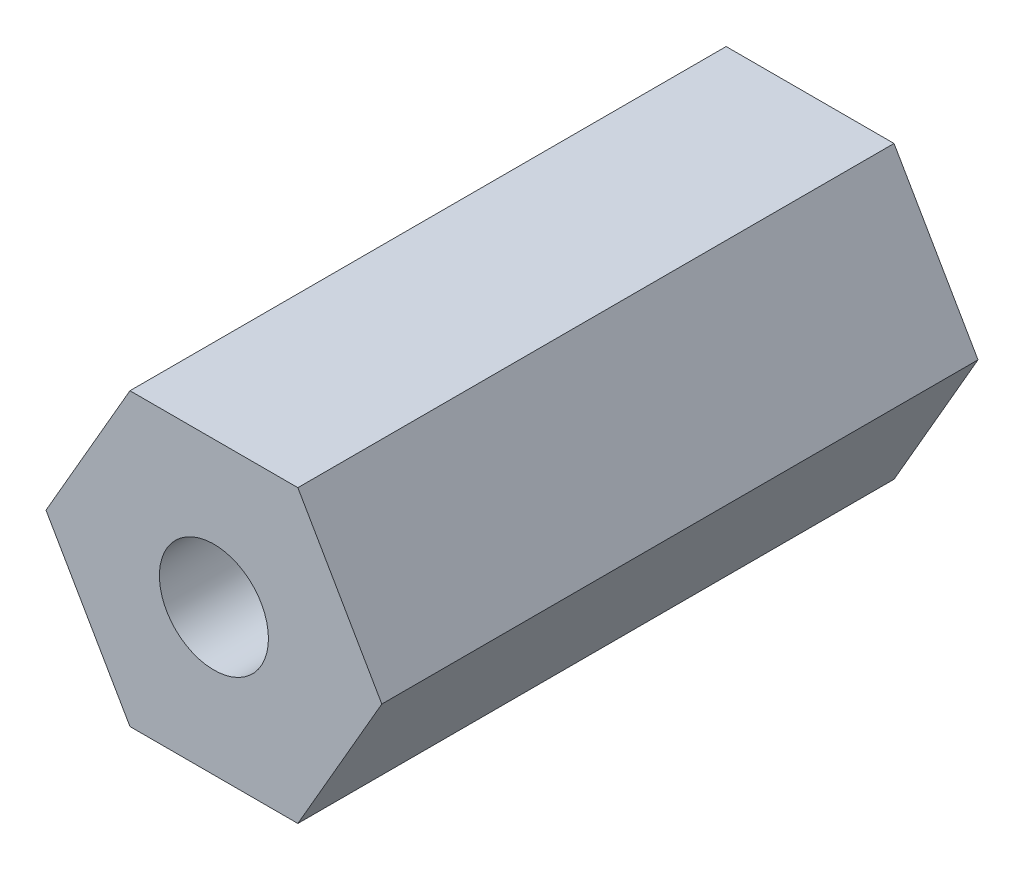
ISO-10303-21;
HEADER;
FILE_DESCRIPTION(('STEP AP214'),'2;1');
FILE_NAME('part.step','',(''),(''),'','','');
FILE_SCHEMA(('AUTOMOTIVE_DESIGN { 1 0 10303 214 1 1 1 1 }'));
ENDSEC;
DATA;
#1=APPLICATION_CONTEXT('core data for automotive mechanical design processes');
#2=APPLICATION_PROTOCOL_DEFINITION('international standard','automotive_design',2000,#1);
#3=PRODUCT_CONTEXT('',#1,'mechanical');
#4=PRODUCT('Part','Part','',(#3));
#5=PRODUCT_RELATED_PRODUCT_CATEGORY('part','',(#4));
#6=PRODUCT_DEFINITION_FORMATION('','',#4);
#7=PRODUCT_DEFINITION_CONTEXT('part definition',#1,'design');
#8=PRODUCT_DEFINITION('design','',#6,#7);
#9=PRODUCT_DEFINITION_SHAPE('','',#8);
#10=(LENGTH_UNIT() NAMED_UNIT(*) SI_UNIT(.MILLI.,.METRE.));
#11=(NAMED_UNIT(*) PLANE_ANGLE_UNIT() SI_UNIT($,.RADIAN.));
#12=(NAMED_UNIT(*) SI_UNIT($,.STERADIAN.) SOLID_ANGLE_UNIT());
#13=UNCERTAINTY_MEASURE_WITH_UNIT(LENGTH_MEASURE(1.E-05),#10,'distance_accuracy_value','');
#14=(GEOMETRIC_REPRESENTATION_CONTEXT(3) GLOBAL_UNCERTAINTY_ASSIGNED_CONTEXT((#13)) GLOBAL_UNIT_ASSIGNED_CONTEXT((#10,
#11,#12)) REPRESENTATION_CONTEXT('',''));
#15=CARTESIAN_POINT('',(0.,0.,0.));
#16=DIRECTION('',(0.,0.,1.));
#17=DIRECTION('',(1.,0.,0.));
#18=AXIS2_PLACEMENT_3D('',#15,#16,#17);
#19=CARTESIAN_POINT('',(7.33234841870825,-12.7,52.07));
#20=DIRECTION('',(-0.866025403784439,0.5,0.));
#21=DIRECTION('',(-0.5,-0.866025403784439,0.));
#22=AXIS2_PLACEMENT_3D('',#19,#20,#21);
#23=PLANE('',#22);
#24=DIRECTION('',(0.5,0.866025403784439,0.));
#25=VECTOR('',#24,1.);
#26=CARTESIAN_POINT('',(7.33234841870825,-12.7,0.));
#27=LINE('',#26,#25);
#28=CARTESIAN_POINT('',(7.33234841870825,-12.7,0.));
#29=VERTEX_POINT('',#28);
#30=CARTESIAN_POINT('',(14.6646968374165,0.,0.));
#31=VERTEX_POINT('',#30);
#32=EDGE_CURVE('E120',#29,#31,#27,.T.);
#33=ORIENTED_EDGE('',*,*,#32,.T.);
#34=DIRECTION('',(0.,0.,-1.));
#35=VECTOR('',#34,1.);
#36=CARTESIAN_POINT('',(14.6646968374165,0.,52.07));
#37=LINE('',#36,#35);
#38=CARTESIAN_POINT('',(14.6646968374165,0.,52.07));
#39=VERTEX_POINT('',#38);
#40=EDGE_CURVE('E11',#39,#31,#37,.T.);
#41=ORIENTED_EDGE('',*,*,#40,.F.);
#42=DIRECTION('',(0.5,0.866025403784439,0.));
#43=VECTOR('',#42,1.);
#44=CARTESIAN_POINT('',(7.33234841870825,-12.7,52.07));
#45=LINE('',#44,#43);
#46=CARTESIAN_POINT('',(7.33234841870825,-12.7,52.07));
#47=VERTEX_POINT('',#46);
#48=EDGE_CURVE('E131',#47,#39,#45,.T.);
#49=ORIENTED_EDGE('',*,*,#48,.F.);
#50=DIRECTION('',(0.,0.,-1.));
#51=VECTOR('',#50,1.);
#52=CARTESIAN_POINT('',(7.33234841870825,-12.7,52.07));
#53=LINE('',#52,#51);
#54=EDGE_CURVE('E116',#47,#29,#53,.T.);
#55=ORIENTED_EDGE('',*,*,#54,.T.);
#56=EDGE_LOOP('',(#33,#41,#49,#55));
#57=FACE_BOUND('',#56,.T.);
#58=ADVANCED_FACE('F36',(#57),#23,.F.);
#59=CARTESIAN_POINT('',(14.6646968374165,0.,52.07));
#60=DIRECTION('',(-0.866025403784439,-0.5,0.));
#61=DIRECTION('',(0.5,-0.866025403784439,0.));
#62=AXIS2_PLACEMENT_3D('',#59,#60,#61);
#63=PLANE('',#62);
#64=DIRECTION('',(-0.5,0.866025403784439,0.));
#65=VECTOR('',#64,1.);
#66=CARTESIAN_POINT('',(14.6646968374165,0.,0.));
#67=LINE('',#66,#65);
#68=CARTESIAN_POINT('',(7.33234841870824,12.7,0.));
#69=VERTEX_POINT('',#68);
#70=EDGE_CURVE('E123',#31,#69,#67,.T.);
#71=ORIENTED_EDGE('',*,*,#70,.T.);
#72=DIRECTION('',(0.,0.,-1.));
#73=VECTOR('',#72,1.);
#74=CARTESIAN_POINT('',(7.33234841870824,12.7,52.07));
#75=LINE('',#74,#73);
#76=CARTESIAN_POINT('',(7.33234841870824,12.7,52.07));
#77=VERTEX_POINT('',#76);
#78=EDGE_CURVE('E44',#77,#69,#75,.T.);
#79=ORIENTED_EDGE('',*,*,#78,.F.);
#80=DIRECTION('',(-0.5,0.866025403784439,0.));
#81=VECTOR('',#80,1.);
#82=CARTESIAN_POINT('',(14.6646968374165,0.,52.07));
#83=LINE('',#82,#81);
#84=EDGE_CURVE('E89',#39,#77,#83,.T.);
#85=ORIENTED_EDGE('',*,*,#84,.F.);
#86=ORIENTED_EDGE('',*,*,#40,.T.);
#87=EDGE_LOOP('',(#71,#79,#85,#86));
#88=FACE_BOUND('',#87,.T.);
#89=ADVANCED_FACE('F156',(#88),#63,.F.);
#90=CARTESIAN_POINT('',(7.33234841870824,12.7,52.07));
#91=DIRECTION('',(0.,-1.,0.));
#92=DIRECTION('',(1.,0.,0.));
#93=AXIS2_PLACEMENT_3D('',#90,#91,#92);
#94=PLANE('',#93);
#95=DIRECTION('',(-1.,0.,0.));
#96=VECTOR('',#95,1.);
#97=CARTESIAN_POINT('',(7.33234841870824,12.7,0.));
#98=LINE('',#97,#96);
#99=CARTESIAN_POINT('',(-7.33234841870825,12.7,0.));
#100=VERTEX_POINT('',#99);
#101=EDGE_CURVE('E126',#69,#100,#98,.T.);
#102=ORIENTED_EDGE('',*,*,#101,.T.);
#103=DIRECTION('',(0.,0.,-1.));
#104=VECTOR('',#103,1.);
#105=CARTESIAN_POINT('',(-7.33234841870825,12.7,52.07));
#106=LINE('',#105,#104);
#107=CARTESIAN_POINT('',(-7.33234841870825,12.7,52.07));
#108=VERTEX_POINT('',#107);
#109=EDGE_CURVE('E111',#108,#100,#106,.T.);
#110=ORIENTED_EDGE('',*,*,#109,.F.);
#111=DIRECTION('',(-1.,0.,0.));
#112=VECTOR('',#111,1.);
#113=CARTESIAN_POINT('',(7.33234841870824,12.7,52.07));
#114=LINE('',#113,#112);
#115=EDGE_CURVE('E102',#77,#108,#114,.T.);
#116=ORIENTED_EDGE('',*,*,#115,.F.);
#117=ORIENTED_EDGE('',*,*,#78,.T.);
#118=EDGE_LOOP('',(#102,#110,#116,#117));
#119=FACE_BOUND('',#118,.T.);
#120=ADVANCED_FACE('F137',(#119),#94,.F.);
#121=CARTESIAN_POINT('',(-7.33234841870825,12.7,52.07));
#122=DIRECTION('',(0.866025403784439,-0.5,0.));
#123=DIRECTION('',(0.5,0.866025403784439,0.));
#124=AXIS2_PLACEMENT_3D('',#121,#122,#123);
#125=PLANE('',#124);
#126=DIRECTION('',(-0.5,-0.866025403784439,0.));
#127=VECTOR('',#126,1.);
#128=CARTESIAN_POINT('',(-7.33234841870825,12.7,0.));
#129=LINE('',#128,#127);
#130=CARTESIAN_POINT('',(-14.6646968374165,0.,0.));
#131=VERTEX_POINT('',#130);
#132=EDGE_CURVE('E110',#100,#131,#129,.T.);
#133=ORIENTED_EDGE('',*,*,#132,.T.);
#134=DIRECTION('',(0.,0.,-1.));
#135=VECTOR('',#134,1.);
#136=CARTESIAN_POINT('',(-14.6646968374165,0.,52.07));
#137=LINE('',#136,#135);
#138=CARTESIAN_POINT('',(-14.6646968374165,0.,52.07));
#139=VERTEX_POINT('',#138);
#140=EDGE_CURVE('E107',#139,#131,#137,.T.);
#141=ORIENTED_EDGE('',*,*,#140,.F.);
#142=DIRECTION('',(-0.5,-0.866025403784439,0.));
#143=VECTOR('',#142,1.);
#144=CARTESIAN_POINT('',(-7.33234841870825,12.7,52.07));
#145=LINE('',#144,#143);
#146=EDGE_CURVE('E96',#108,#139,#145,.T.);
#147=ORIENTED_EDGE('',*,*,#146,.F.);
#148=ORIENTED_EDGE('',*,*,#109,.T.);
#149=EDGE_LOOP('',(#133,#141,#147,#148));
#150=FACE_BOUND('',#149,.T.);
#151=ADVANCED_FACE('F108',(#150),#125,.F.);
#152=CARTESIAN_POINT('',(-14.6646968374165,0.,52.07));
#153=DIRECTION('',(0.866025403784438,0.5,0.));
#154=DIRECTION('',(-0.5,0.866025403784439,0.));
#155=AXIS2_PLACEMENT_3D('',#152,#153,#154);
#156=PLANE('',#155);
#157=DIRECTION('',(0.5,-0.866025403784438,0.));
#158=VECTOR('',#157,1.);
#159=CARTESIAN_POINT('',(-14.6646968374165,0.,0.));
#160=LINE('',#159,#158);
#161=CARTESIAN_POINT('',(-7.33234841870825,-12.7,0.));
#162=VERTEX_POINT('',#161);
#163=EDGE_CURVE('E75',#131,#162,#160,.T.);
#164=ORIENTED_EDGE('',*,*,#163,.T.);
#165=DIRECTION('',(0.,0.,-1.));
#166=VECTOR('',#165,1.);
#167=CARTESIAN_POINT('',(-7.33234841870825,-12.7,52.07));
#168=LINE('',#167,#166);
#169=CARTESIAN_POINT('',(-7.33234841870825,-12.7,52.07));
#170=VERTEX_POINT('',#169);
#171=EDGE_CURVE('E112',#170,#162,#168,.T.);
#172=ORIENTED_EDGE('',*,*,#171,.F.);
#173=DIRECTION('',(0.5,-0.866025403784438,0.));
#174=VECTOR('',#173,1.);
#175=CARTESIAN_POINT('',(-14.6646968374165,0.,52.07));
#176=LINE('',#175,#174);
#177=EDGE_CURVE('E100',#139,#170,#176,.T.);
#178=ORIENTED_EDGE('',*,*,#177,.F.);
#179=ORIENTED_EDGE('',*,*,#140,.T.);
#180=EDGE_LOOP('',(#164,#172,#178,#179));
#181=FACE_BOUND('',#180,.T.);
#182=ADVANCED_FACE('F114',(#181),#156,.F.);
#183=CARTESIAN_POINT('',(-7.33234841870825,-12.7,52.07));
#184=DIRECTION('',(0.,1.,0.));
#185=DIRECTION('',(0.,0.,1.));
#186=AXIS2_PLACEMENT_3D('',#183,#184,#185);
#187=PLANE('',#186);
#188=DIRECTION('',(1.,0.,0.));
#189=VECTOR('',#188,1.);
#190=CARTESIAN_POINT('',(-7.33234841870825,-12.7,0.));
#191=LINE('',#190,#189);
#192=EDGE_CURVE('E81',#162,#29,#191,.T.);
#193=ORIENTED_EDGE('',*,*,#192,.T.);
#194=ORIENTED_EDGE('',*,*,#54,.F.);
#195=DIRECTION('',(1.,0.,0.));
#196=VECTOR('',#195,1.);
#197=CARTESIAN_POINT('',(-7.33234841870825,-12.7,52.07));
#198=LINE('',#197,#196);
#199=EDGE_CURVE('E52',#170,#47,#198,.T.);
#200=ORIENTED_EDGE('',*,*,#199,.F.);
#201=ORIENTED_EDGE('',*,*,#171,.T.);
#202=EDGE_LOOP('',(#193,#194,#200,#201));
#203=FACE_BOUND('',#202,.T.);
#204=ADVANCED_FACE('F144',(#203),#187,.F.);
#205=CARTESIAN_POINT('',(14.6646968374165,0.,52.07));
#206=DIRECTION('',(0.,0.,1.));
#207=DIRECTION('',(1.,0.,0.));
#208=AXIS2_PLACEMENT_3D('',#205,#206,#207);
#209=PLANE('',#208);
#210=CARTESIAN_POINT('',(0.,0.,52.07));
#211=DIRECTION('',(0.,0.,1.));
#212=DIRECTION('',(1.,0.,0.));
#213=AXIS2_PLACEMENT_3D('',#210,#211,#212);
#214=CIRCLE('',#213,4.76249999999999);
#215=CARTESIAN_POINT('',(4.76249999999999,0.,52.07));
#216=VERTEX_POINT('',#215);
#217=EDGE_CURVE('E211',#216,#216,#214,.T.);
#218=ORIENTED_EDGE('',*,*,#217,.F.);
#219=EDGE_LOOP('',(#218));
#220=FACE_BOUND('',#219,.T.);
#221=ORIENTED_EDGE('',*,*,#48,.T.);
#222=ORIENTED_EDGE('',*,*,#84,.T.);
#223=ORIENTED_EDGE('',*,*,#115,.T.);
#224=ORIENTED_EDGE('',*,*,#146,.T.);
#225=ORIENTED_EDGE('',*,*,#177,.T.);
#226=ORIENTED_EDGE('',*,*,#199,.T.);
#227=EDGE_LOOP('',(#221,#222,#223,#224,#225,#226));
#228=FACE_BOUND('',#227,.T.);
#229=ADVANCED_FACE('F98',(#220,#228),#209,.T.);
#230=CARTESIAN_POINT('',(14.6646968374165,0.,0.));
#231=DIRECTION('',(0.,0.,1.));
#232=DIRECTION('',(1.,0.,0.));
#233=AXIS2_PLACEMENT_3D('',#230,#231,#232);
#234=PLANE('',#233);
#235=CARTESIAN_POINT('',(0.,0.,0.));
#236=DIRECTION('',(0.,0.,1.));
#237=DIRECTION('',(1.,0.,0.));
#238=AXIS2_PLACEMENT_3D('',#235,#236,#237);
#239=CIRCLE('',#238,4.76249999999999);
#240=CARTESIAN_POINT('',(4.76249999999999,0.,0.));
#241=VERTEX_POINT('',#240);
#242=EDGE_CURVE('E124',#241,#241,#239,.T.);
#243=ORIENTED_EDGE('',*,*,#242,.T.);
#244=EDGE_LOOP('',(#243));
#245=FACE_BOUND('',#244,.T.);
#246=ORIENTED_EDGE('',*,*,#32,.F.);
#247=ORIENTED_EDGE('',*,*,#192,.F.);
#248=ORIENTED_EDGE('',*,*,#163,.F.);
#249=ORIENTED_EDGE('',*,*,#132,.F.);
#250=ORIENTED_EDGE('',*,*,#101,.F.);
#251=ORIENTED_EDGE('',*,*,#70,.F.);
#252=EDGE_LOOP('',(#246,#247,#248,#249,#250,#251));
#253=FACE_BOUND('',#252,.T.);
#254=ADVANCED_FACE('F140',(#245,#253),#234,.F.);
#255=CARTESIAN_POINT('',(0.,0.,52.07));
#256=DIRECTION('',(0.,0.,1.));
#257=DIRECTION('',(1.,0.,0.));
#258=AXIS2_PLACEMENT_3D('',#255,#256,#257);
#259=CYLINDRICAL_SURFACE('',#258,4.76249999999999);
#260=ORIENTED_EDGE('',*,*,#242,.F.);
#261=EDGE_LOOP('',(#260));
#262=FACE_BOUND('',#261,.T.);
#263=ORIENTED_EDGE('',*,*,#217,.T.);
#264=EDGE_LOOP('',(#263));
#265=FACE_BOUND('',#264,.T.);
#266=ADVANCED_FACE('F193',(#262,#265),#259,.F.);
#267=CLOSED_SHELL('',(#58,#89,#120,#151,#182,#204,#229,#254,#266));
#268=MANIFOLD_SOLID_BREP('B2',#267);
#269=ADVANCED_BREP_SHAPE_REPRESENTATION('',(#18,#268),#14);
#270=SHAPE_DEFINITION_REPRESENTATION(#9,#269);
ENDSEC;
END-ISO-10303-21;
